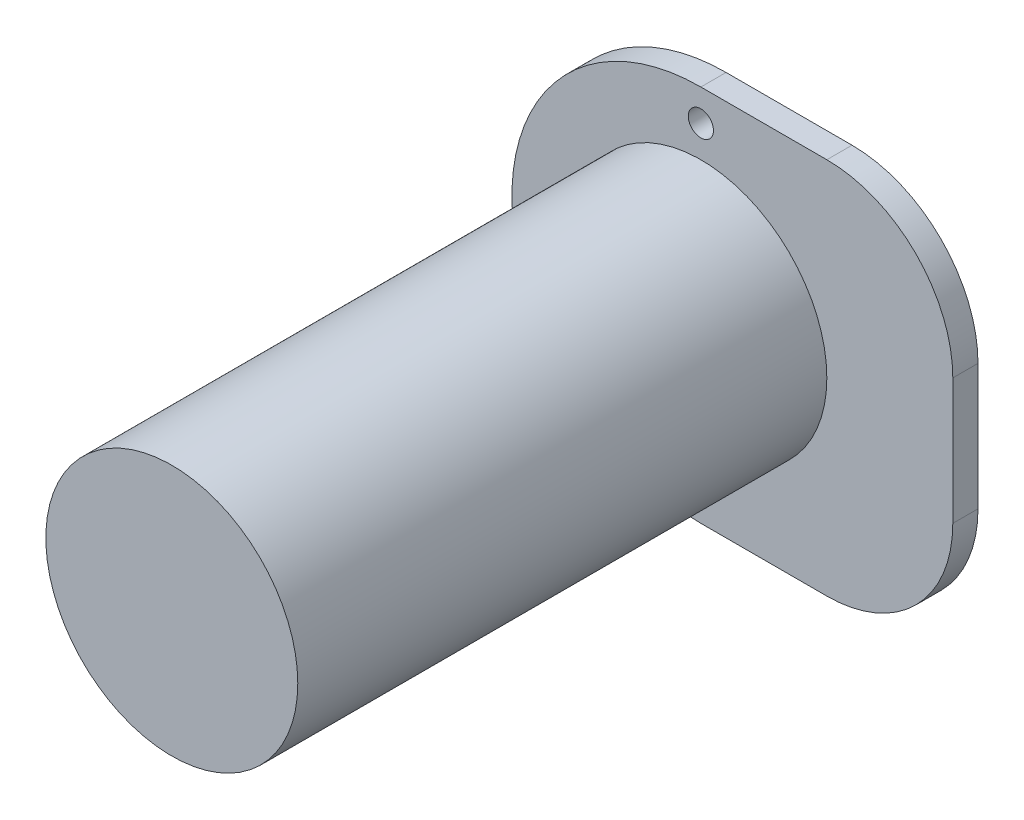
ISO-10303-21;
HEADER;
FILE_DESCRIPTION(('STEP AP214'),'2;1');
FILE_NAME('part.step','',(''),(''),'','','');
FILE_SCHEMA(('AUTOMOTIVE_DESIGN { 1 0 10303 214 1 1 1 1 }'));
ENDSEC;
DATA;
#1=APPLICATION_CONTEXT('core data for automotive mechanical design processes');
#2=APPLICATION_PROTOCOL_DEFINITION('international standard','automotive_design',2000,#1);
#3=PRODUCT_CONTEXT('',#1,'mechanical');
#4=PRODUCT('Part','Part','',(#3));
#5=PRODUCT_RELATED_PRODUCT_CATEGORY('part','',(#4));
#6=PRODUCT_DEFINITION_FORMATION('','',#4);
#7=PRODUCT_DEFINITION_CONTEXT('part definition',#1,'design');
#8=PRODUCT_DEFINITION('design','',#6,#7);
#9=PRODUCT_DEFINITION_SHAPE('','',#8);
#10=(LENGTH_UNIT() NAMED_UNIT(*) SI_UNIT(.MILLI.,.METRE.));
#11=(NAMED_UNIT(*) PLANE_ANGLE_UNIT() SI_UNIT($,.RADIAN.));
#12=(NAMED_UNIT(*) SI_UNIT($,.STERADIAN.) SOLID_ANGLE_UNIT());
#13=UNCERTAINTY_MEASURE_WITH_UNIT(LENGTH_MEASURE(1.E-05),#10,'distance_accuracy_value','');
#14=(GEOMETRIC_REPRESENTATION_CONTEXT(3) GLOBAL_UNCERTAINTY_ASSIGNED_CONTEXT((#13)) GLOBAL_UNIT_ASSIGNED_CONTEXT((#10,
#11,#12)) REPRESENTATION_CONTEXT('',''));
#15=CARTESIAN_POINT('',(0.,0.,0.));
#16=DIRECTION('',(0.,0.,1.));
#17=DIRECTION('',(1.,0.,0.));
#18=AXIS2_PLACEMENT_3D('',#15,#16,#17);
#19=CARTESIAN_POINT('',(0.,0.,210.));
#20=DIRECTION('',(0.,0.,-1.));
#21=DIRECTION('',(-1.,0.,0.));
#22=AXIS2_PLACEMENT_3D('',#19,#20,#21);
#23=CYLINDRICAL_SURFACE('',#22,50.);
#24=CARTESIAN_POINT('',(0.,0.,210.));
#25=DIRECTION('',(0.,0.,1.));
#26=DIRECTION('',(1.,0.,0.));
#27=AXIS2_PLACEMENT_3D('',#24,#25,#26);
#28=CIRCLE('',#27,50.);
#29=CARTESIAN_POINT('',(50.,0.,210.));
#30=VERTEX_POINT('',#29);
#31=EDGE_CURVE('E128',#30,#30,#28,.T.);
#32=ORIENTED_EDGE('',*,*,#31,.F.);
#33=EDGE_LOOP('',(#32));
#34=FACE_BOUND('',#33,.T.);
#35=CARTESIAN_POINT('',(0.,0.,0.));
#36=DIRECTION('',(0.,0.,1.));
#37=DIRECTION('',(1.,0.,0.));
#38=AXIS2_PLACEMENT_3D('',#35,#36,#37);
#39=CIRCLE('',#38,50.);
#40=CARTESIAN_POINT('',(50.,0.,0.));
#41=VERTEX_POINT('',#40);
#42=EDGE_CURVE('E122',#41,#41,#39,.T.);
#43=ORIENTED_EDGE('',*,*,#42,.T.);
#44=EDGE_LOOP('',(#43));
#45=FACE_BOUND('',#44,.T.);
#46=ADVANCED_FACE('F43',(#34,#45),#23,.T.);
#47=CARTESIAN_POINT('',(0.,0.,210.));
#48=DIRECTION('',(0.,0.,1.));
#49=DIRECTION('',(1.,0.,0.));
#50=AXIS2_PLACEMENT_3D('',#47,#48,#49);
#51=PLANE('',#50);
#52=ORIENTED_EDGE('',*,*,#31,.T.);
#53=EDGE_LOOP('',(#52));
#54=FACE_BOUND('',#53,.T.);
#55=ADVANCED_FACE('F230',(#54),#51,.T.);
#56=CARTESIAN_POINT('',(0.,0.,-10.));
#57=DIRECTION('',(0.,0.,1.));
#58=DIRECTION('',(1.,0.,0.));
#59=AXIS2_PLACEMENT_3D('',#56,#57,#58);
#60=CYLINDRICAL_SURFACE('',#59,75.);
#61=CARTESIAN_POINT('',(0.,0.,0.));
#62=DIRECTION('',(0.,0.,-1.));
#63=DIRECTION('',(-1.,0.,0.));
#64=AXIS2_PLACEMENT_3D('',#61,#62,#63);
#65=CIRCLE('',#64,75.);
#66=CARTESIAN_POINT('',(0.,-75.,0.));
#67=VERTEX_POINT('',#66);
#68=CARTESIAN_POINT('',(0.,75.,0.));
#69=VERTEX_POINT('',#68);
#70=EDGE_CURVE('E120',#67,#69,#65,.T.);
#71=ORIENTED_EDGE('',*,*,#70,.T.);
#72=DIRECTION('',(0.,0.,1.));
#73=VECTOR('',#72,1.);
#74=CARTESIAN_POINT('',(0.,75.,-10.));
#75=LINE('',#74,#73);
#76=CARTESIAN_POINT('',(0.,75.,-10.));
#77=VERTEX_POINT('',#76);
#78=EDGE_CURVE('E100',#77,#69,#75,.T.);
#79=ORIENTED_EDGE('',*,*,#78,.F.);
#80=CARTESIAN_POINT('',(0.,0.,-10.));
#81=DIRECTION('',(0.,0.,-1.));
#82=DIRECTION('',(-1.,0.,0.));
#83=AXIS2_PLACEMENT_3D('',#80,#81,#82);
#84=CIRCLE('',#83,75.);
#85=CARTESIAN_POINT('',(0.,-75.,-10.));
#86=VERTEX_POINT('',#85);
#87=EDGE_CURVE('E106',#86,#77,#84,.T.);
#88=ORIENTED_EDGE('',*,*,#87,.F.);
#89=DIRECTION('',(0.,0.,1.));
#90=VECTOR('',#89,1.);
#91=CARTESIAN_POINT('',(0.,-75.,-10.));
#92=LINE('',#91,#90);
#93=EDGE_CURVE('E123',#86,#67,#92,.T.);
#94=ORIENTED_EDGE('',*,*,#93,.T.);
#95=EDGE_LOOP('',(#71,#79,#88,#94));
#96=FACE_BOUND('',#95,.T.);
#97=ADVANCED_FACE('F118',(#96),#60,.T.);
#98=CARTESIAN_POINT('',(0.,75.,-10.));
#99=DIRECTION('',(0.,-1.,0.));
#100=DIRECTION('',(1.,0.,0.));
#101=AXIS2_PLACEMENT_3D('',#98,#99,#100);
#102=PLANE('',#101);
#103=DIRECTION('',(1.,0.,0.));
#104=VECTOR('',#103,1.);
#105=CARTESIAN_POINT('',(0.,75.,0.));
#106=LINE('',#105,#104);
#107=CARTESIAN_POINT('',(50.,75.,0.));
#108=VERTEX_POINT('',#107);
#109=EDGE_CURVE('E171',#69,#108,#106,.T.);
#110=ORIENTED_EDGE('',*,*,#109,.T.);
#111=DIRECTION('',(0.,0.,1.));
#112=VECTOR('',#111,1.);
#113=CARTESIAN_POINT('',(50.,75.,-10.));
#114=LINE('',#113,#112);
#115=CARTESIAN_POINT('',(50.,75.,-10.));
#116=VERTEX_POINT('',#115);
#117=EDGE_CURVE('E11',#108,#116,#114,.F.);
#118=ORIENTED_EDGE('',*,*,#117,.T.);
#119=DIRECTION('',(1.,0.,0.));
#120=VECTOR('',#119,1.);
#121=CARTESIAN_POINT('',(0.,75.,-10.));
#122=LINE('',#121,#120);
#123=EDGE_CURVE('E96',#77,#116,#122,.T.);
#124=ORIENTED_EDGE('',*,*,#123,.F.);
#125=ORIENTED_EDGE('',*,*,#78,.T.);
#126=EDGE_LOOP('',(#110,#118,#124,#125));
#127=FACE_BOUND('',#126,.T.);
#128=ADVANCED_FACE('F98',(#127),#102,.F.);
#129=CARTESIAN_POINT('',(100.,-75.,-10.));
#130=DIRECTION('',(-1.,0.,0.));
#131=DIRECTION('',(0.,0.,1.));
#132=AXIS2_PLACEMENT_3D('',#129,#130,#131);
#133=PLANE('',#132);
#134=DIRECTION('',(0.,-1.,0.));
#135=VECTOR('',#134,1.);
#136=CARTESIAN_POINT('',(100.,-75.,0.));
#137=LINE('',#136,#135);
#138=CARTESIAN_POINT('',(100.,25.,0.));
#139=VERTEX_POINT('',#138);
#140=CARTESIAN_POINT('',(100.,-25.,0.));
#141=VERTEX_POINT('',#140);
#142=EDGE_CURVE('E167',#139,#141,#137,.T.);
#143=ORIENTED_EDGE('',*,*,#142,.T.);
#144=DIRECTION('',(0.,0.,1.));
#145=VECTOR('',#144,1.);
#146=CARTESIAN_POINT('',(100.,-25.,-10.));
#147=LINE('',#146,#145);
#148=CARTESIAN_POINT('',(100.,-25.,-10.));
#149=VERTEX_POINT('',#148);
#150=EDGE_CURVE('E65',#141,#149,#147,.F.);
#151=ORIENTED_EDGE('',*,*,#150,.T.);
#152=DIRECTION('',(0.,-1.,0.));
#153=VECTOR('',#152,1.);
#154=CARTESIAN_POINT('',(100.,-75.,-10.));
#155=LINE('',#154,#153);
#156=CARTESIAN_POINT('',(100.,25.,-10.));
#157=VERTEX_POINT('',#156);
#158=EDGE_CURVE('E105',#157,#149,#155,.T.);
#159=ORIENTED_EDGE('',*,*,#158,.F.);
#160=DIRECTION('',(0.,0.,1.));
#161=VECTOR('',#160,1.);
#162=CARTESIAN_POINT('',(100.,25.,-10.));
#163=LINE('',#162,#161);
#164=EDGE_CURVE('E146',#157,#139,#163,.T.);
#165=ORIENTED_EDGE('',*,*,#164,.T.);
#166=EDGE_LOOP('',(#143,#151,#159,#165));
#167=FACE_BOUND('',#166,.T.);
#168=ADVANCED_FACE('F168',(#167),#133,.F.);
#169=CARTESIAN_POINT('',(0.,-75.,-10.));
#170=DIRECTION('',(0.,1.,0.));
#171=DIRECTION('',(-1.,0.,0.));
#172=AXIS2_PLACEMENT_3D('',#169,#170,#171);
#173=PLANE('',#172);
#174=DIRECTION('',(-1.,0.,0.));
#175=VECTOR('',#174,1.);
#176=CARTESIAN_POINT('',(0.,-75.,-10.));
#177=LINE('',#176,#175);
#178=CARTESIAN_POINT('',(50.,-75.,-10.));
#179=VERTEX_POINT('',#178);
#180=EDGE_CURVE('E111',#179,#86,#177,.T.);
#181=ORIENTED_EDGE('',*,*,#180,.F.);
#182=DIRECTION('',(0.,0.,1.));
#183=VECTOR('',#182,1.);
#184=CARTESIAN_POINT('',(50.,-75.,-10.));
#185=LINE('',#184,#183);
#186=CARTESIAN_POINT('',(50.,-75.,0.));
#187=VERTEX_POINT('',#186);
#188=EDGE_CURVE('E135',#179,#187,#185,.T.);
#189=ORIENTED_EDGE('',*,*,#188,.T.);
#190=DIRECTION('',(-1.,0.,0.));
#191=VECTOR('',#190,1.);
#192=CARTESIAN_POINT('',(0.,-75.,0.));
#193=LINE('',#192,#191);
#194=EDGE_CURVE('E116',#187,#67,#193,.T.);
#195=ORIENTED_EDGE('',*,*,#194,.T.);
#196=ORIENTED_EDGE('',*,*,#93,.F.);
#197=EDGE_LOOP('',(#181,#189,#195,#196));
#198=FACE_BOUND('',#197,.T.);
#199=ADVANCED_FACE('F159',(#198),#173,.F.);
#200=CARTESIAN_POINT('',(0.,0.,-10.));
#201=DIRECTION('',(0.,0.,-1.));
#202=DIRECTION('',(-1.,0.,0.));
#203=AXIS2_PLACEMENT_3D('',#200,#201,#202);
#204=PLANE('',#203);
#205=CARTESIAN_POINT('',(0.,62.5,-10.));
#206=DIRECTION('',(0.,0.,-1.));
#207=DIRECTION('',(-1.,0.,0.));
#208=AXIS2_PLACEMENT_3D('',#205,#206,#207);
#209=CIRCLE('',#208,5.);
#210=CARTESIAN_POINT('',(-5.,62.5,-10.));
#211=VERTEX_POINT('',#210);
#212=EDGE_CURVE('E195',#211,#211,#209,.T.);
#213=ORIENTED_EDGE('',*,*,#212,.F.);
#214=EDGE_LOOP('',(#213));
#215=FACE_BOUND('',#214,.T.);
#216=CARTESIAN_POINT('',(0.,-62.5,-10.));
#217=DIRECTION('',(0.,0.,-1.));
#218=DIRECTION('',(-1.,0.,0.));
#219=AXIS2_PLACEMENT_3D('',#216,#217,#218);
#220=CIRCLE('',#219,5.);
#221=CARTESIAN_POINT('',(-5.,-62.5,-10.));
#222=VERTEX_POINT('',#221);
#223=EDGE_CURVE('E191',#222,#222,#220,.T.);
#224=ORIENTED_EDGE('',*,*,#223,.F.);
#225=EDGE_LOOP('',(#224));
#226=FACE_BOUND('',#225,.T.);
#227=CARTESIAN_POINT('',(-62.5,0.,-10.));
#228=DIRECTION('',(0.,0.,-1.));
#229=DIRECTION('',(-1.,0.,0.));
#230=AXIS2_PLACEMENT_3D('',#227,#228,#229);
#231=CIRCLE('',#230,5.);
#232=CARTESIAN_POINT('',(-67.5,0.,-10.));
#233=VERTEX_POINT('',#232);
#234=EDGE_CURVE('E182',#233,#233,#231,.T.);
#235=ORIENTED_EDGE('',*,*,#234,.F.);
#236=EDGE_LOOP('',(#235));
#237=FACE_BOUND('',#236,.T.);
#238=ORIENTED_EDGE('',*,*,#158,.T.);
#239=CARTESIAN_POINT('',(50.,-25.,-10.));
#240=DIRECTION('',(0.,0.,-1.));
#241=DIRECTION('',(-1.,0.,0.));
#242=AXIS2_PLACEMENT_3D('',#239,#240,#241);
#243=CIRCLE('',#242,50.);
#244=EDGE_CURVE('E52',#149,#179,#243,.T.);
#245=ORIENTED_EDGE('',*,*,#244,.T.);
#246=ORIENTED_EDGE('',*,*,#180,.T.);
#247=ORIENTED_EDGE('',*,*,#87,.T.);
#248=ORIENTED_EDGE('',*,*,#123,.T.);
#249=CARTESIAN_POINT('',(50.,25.,-10.));
#250=DIRECTION('',(0.,0.,-1.));
#251=DIRECTION('',(-1.,0.,0.));
#252=AXIS2_PLACEMENT_3D('',#249,#250,#251);
#253=CIRCLE('',#252,50.);
#254=EDGE_CURVE('E152',#116,#157,#253,.T.);
#255=ORIENTED_EDGE('',*,*,#254,.T.);
#256=EDGE_LOOP('',(#238,#245,#246,#247,#248,#255));
#257=FACE_BOUND('',#256,.T.);
#258=ADVANCED_FACE('F109',(#215,#226,#237,#257),#204,.T.);
#259=CARTESIAN_POINT('',(0.,0.,0.));
#260=DIRECTION('',(0.,0.,-1.));
#261=DIRECTION('',(-1.,0.,0.));
#262=AXIS2_PLACEMENT_3D('',#259,#260,#261);
#263=PLANE('',#262);
#264=CARTESIAN_POINT('',(0.,62.5,0.));
#265=DIRECTION('',(0.,0.,-1.));
#266=DIRECTION('',(-1.,0.,0.));
#267=AXIS2_PLACEMENT_3D('',#264,#265,#266);
#268=CIRCLE('',#267,5.);
#269=CARTESIAN_POINT('',(-5.,62.5,0.));
#270=VERTEX_POINT('',#269);
#271=EDGE_CURVE('E178',#270,#270,#268,.F.);
#272=ORIENTED_EDGE('',*,*,#271,.F.);
#273=EDGE_LOOP('',(#272));
#274=FACE_BOUND('',#273,.T.);
#275=CARTESIAN_POINT('',(0.,-62.5,0.));
#276=DIRECTION('',(0.,0.,-1.));
#277=DIRECTION('',(-1.,0.,0.));
#278=AXIS2_PLACEMENT_3D('',#275,#276,#277);
#279=CIRCLE('',#278,5.);
#280=CARTESIAN_POINT('',(-5.,-62.5,0.));
#281=VERTEX_POINT('',#280);
#282=EDGE_CURVE('E186',#281,#281,#279,.F.);
#283=ORIENTED_EDGE('',*,*,#282,.F.);
#284=EDGE_LOOP('',(#283));
#285=FACE_BOUND('',#284,.T.);
#286=CARTESIAN_POINT('',(-62.5,0.,0.));
#287=DIRECTION('',(0.,0.,-1.));
#288=DIRECTION('',(-1.,0.,0.));
#289=AXIS2_PLACEMENT_3D('',#286,#287,#288);
#290=CIRCLE('',#289,5.);
#291=CARTESIAN_POINT('',(-67.5,0.,0.));
#292=VERTEX_POINT('',#291);
#293=EDGE_CURVE('E187',#292,#292,#290,.F.);
#294=ORIENTED_EDGE('',*,*,#293,.F.);
#295=EDGE_LOOP('',(#294));
#296=FACE_BOUND('',#295,.T.);
#297=ORIENTED_EDGE('',*,*,#42,.F.);
#298=EDGE_LOOP('',(#297));
#299=FACE_BOUND('',#298,.T.);
#300=ORIENTED_EDGE('',*,*,#194,.F.);
#301=CARTESIAN_POINT('',(50.,-25.,0.));
#302=DIRECTION('',(0.,0.,-1.));
#303=DIRECTION('',(-1.,0.,0.));
#304=AXIS2_PLACEMENT_3D('',#301,#302,#303);
#305=CIRCLE('',#304,50.);
#306=EDGE_CURVE('E143',#187,#141,#305,.F.);
#307=ORIENTED_EDGE('',*,*,#306,.T.);
#308=ORIENTED_EDGE('',*,*,#142,.F.);
#309=CARTESIAN_POINT('',(50.,25.,0.));
#310=DIRECTION('',(0.,0.,-1.));
#311=DIRECTION('',(-1.,0.,0.));
#312=AXIS2_PLACEMENT_3D('',#309,#310,#311);
#313=CIRCLE('',#312,50.);
#314=EDGE_CURVE('E140',#139,#108,#313,.F.);
#315=ORIENTED_EDGE('',*,*,#314,.T.);
#316=ORIENTED_EDGE('',*,*,#109,.F.);
#317=ORIENTED_EDGE('',*,*,#70,.F.);
#318=EDGE_LOOP('',(#300,#307,#308,#315,#316,#317));
#319=FACE_BOUND('',#318,.T.);
#320=ADVANCED_FACE('F166',(#274,#285,#296,#299,#319),#263,.F.);
#321=CARTESIAN_POINT('',(-62.5,0.,210.001));
#322=DIRECTION('',(0.,0.,-1.));
#323=DIRECTION('',(-1.,0.,0.));
#324=AXIS2_PLACEMENT_3D('',#321,#322,#323);
#325=CYLINDRICAL_SURFACE('',#324,5.);
#326=ORIENTED_EDGE('',*,*,#234,.T.);
#327=EDGE_LOOP('',(#326));
#328=FACE_BOUND('',#327,.T.);
#329=ORIENTED_EDGE('',*,*,#293,.T.);
#330=EDGE_LOOP('',(#329));
#331=FACE_BOUND('',#330,.T.);
#332=ADVANCED_FACE('F216',(#328,#331),#325,.F.);
#333=CARTESIAN_POINT('',(0.,-62.5,210.001));
#334=DIRECTION('',(0.,0.,-1.));
#335=DIRECTION('',(-1.,0.,0.));
#336=AXIS2_PLACEMENT_3D('',#333,#334,#335);
#337=CYLINDRICAL_SURFACE('',#336,5.);
#338=ORIENTED_EDGE('',*,*,#223,.T.);
#339=EDGE_LOOP('',(#338));
#340=FACE_BOUND('',#339,.T.);
#341=ORIENTED_EDGE('',*,*,#282,.T.);
#342=EDGE_LOOP('',(#341));
#343=FACE_BOUND('',#342,.T.);
#344=ADVANCED_FACE('F219',(#340,#343),#337,.F.);
#345=CARTESIAN_POINT('',(0.,62.5,210.001));
#346=DIRECTION('',(0.,0.,-1.));
#347=DIRECTION('',(-1.,0.,0.));
#348=AXIS2_PLACEMENT_3D('',#345,#346,#347);
#349=CYLINDRICAL_SURFACE('',#348,5.);
#350=ORIENTED_EDGE('',*,*,#212,.T.);
#351=EDGE_LOOP('',(#350));
#352=FACE_BOUND('',#351,.T.);
#353=ORIENTED_EDGE('',*,*,#271,.T.);
#354=EDGE_LOOP('',(#353));
#355=FACE_BOUND('',#354,.T.);
#356=ADVANCED_FACE('F206',(#352,#355),#349,.F.);
#357=CARTESIAN_POINT('',(50.,-25.,-10.));
#358=DIRECTION('',(0.,0.,1.));
#359=DIRECTION('',(1.,0.,0.));
#360=AXIS2_PLACEMENT_3D('',#357,#358,#359);
#361=CYLINDRICAL_SURFACE('',#360,50.);
#362=ORIENTED_EDGE('',*,*,#244,.F.);
#363=ORIENTED_EDGE('',*,*,#150,.F.);
#364=ORIENTED_EDGE('',*,*,#306,.F.);
#365=ORIENTED_EDGE('',*,*,#188,.F.);
#366=EDGE_LOOP('',(#362,#363,#364,#365));
#367=FACE_BOUND('',#366,.T.);
#368=ADVANCED_FACE('F163',(#367),#361,.T.);
#369=CARTESIAN_POINT('',(50.,25.,-10.));
#370=DIRECTION('',(0.,0.,1.));
#371=DIRECTION('',(1.,0.,0.));
#372=AXIS2_PLACEMENT_3D('',#369,#370,#371);
#373=CYLINDRICAL_SURFACE('',#372,50.);
#374=ORIENTED_EDGE('',*,*,#254,.F.);
#375=ORIENTED_EDGE('',*,*,#117,.F.);
#376=ORIENTED_EDGE('',*,*,#314,.F.);
#377=ORIENTED_EDGE('',*,*,#164,.F.);
#378=EDGE_LOOP('',(#374,#375,#376,#377));
#379=FACE_BOUND('',#378,.T.);
#380=ADVANCED_FACE('F45',(#379),#373,.T.);
#381=CLOSED_SHELL('',(#46,#55,#97,#128,#168,#199,#258,#320,#332,#344,#356,#368,#380));
#382=MANIFOLD_SOLID_BREP('B2',#381);
#383=ADVANCED_BREP_SHAPE_REPRESENTATION('',(#18,#382),#14);
#384=SHAPE_DEFINITION_REPRESENTATION(#9,#383);
ENDSEC;
END-ISO-10303-21;
